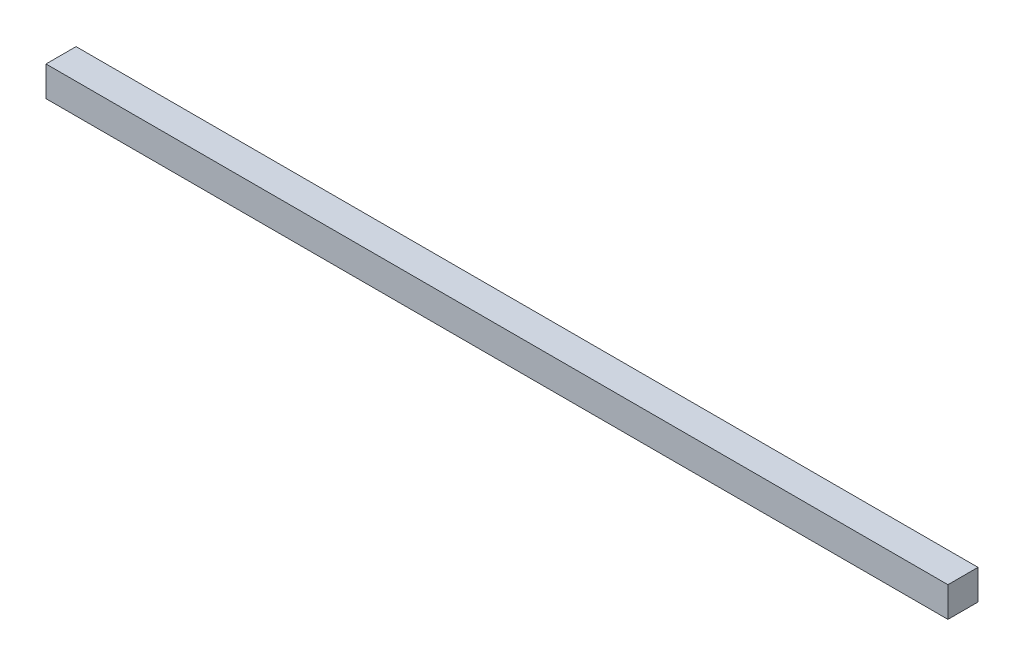
ISO-10303-21;
HEADER;
FILE_DESCRIPTION(('STEP AP214'),'2;1');
FILE_NAME('part.step','',(''),(''),'','','');
FILE_SCHEMA(('AUTOMOTIVE_DESIGN { 1 0 10303 214 1 1 1 1 }'));
ENDSEC;
DATA;
#1=APPLICATION_CONTEXT('core data for automotive mechanical design processes');
#2=APPLICATION_PROTOCOL_DEFINITION('international standard','automotive_design',2000,#1);
#3=PRODUCT_CONTEXT('',#1,'mechanical');
#4=PRODUCT('Part','Part','',(#3));
#5=PRODUCT_RELATED_PRODUCT_CATEGORY('part','',(#4));
#6=PRODUCT_DEFINITION_FORMATION('','',#4);
#7=PRODUCT_DEFINITION_CONTEXT('part definition',#1,'design');
#8=PRODUCT_DEFINITION('design','',#6,#7);
#9=PRODUCT_DEFINITION_SHAPE('','',#8);
#10=(LENGTH_UNIT() NAMED_UNIT(*) SI_UNIT(.MILLI.,.METRE.));
#11=(NAMED_UNIT(*) PLANE_ANGLE_UNIT() SI_UNIT($,.RADIAN.));
#12=(NAMED_UNIT(*) SI_UNIT($,.STERADIAN.) SOLID_ANGLE_UNIT());
#13=UNCERTAINTY_MEASURE_WITH_UNIT(LENGTH_MEASURE(1.E-05),#10,'distance_accuracy_value','');
#14=(GEOMETRIC_REPRESENTATION_CONTEXT(3) GLOBAL_UNCERTAINTY_ASSIGNED_CONTEXT((#13)) GLOBAL_UNIT_ASSIGNED_CONTEXT((#10,
#11,#12)) REPRESENTATION_CONTEXT('',''));
#15=CARTESIAN_POINT('',(0.,0.,0.));
#16=DIRECTION('',(0.,0.,1.));
#17=DIRECTION('',(1.,0.,0.));
#18=AXIS2_PLACEMENT_3D('',#15,#16,#17);
#19=CARTESIAN_POINT('',(762.,0.,0.));
#20=DIRECTION('',(0.,0.,-1.));
#21=DIRECTION('',(0.,1.,0.));
#22=AXIS2_PLACEMENT_3D('',#19,#20,#21);
#23=PLANE('',#22);
#24=DIRECTION('',(0.,-1.,0.));
#25=VECTOR('',#24,1.);
#26=CARTESIAN_POINT('',(0.,0.,0.));
#27=LINE('',#26,#25);
#28=CARTESIAN_POINT('',(0.,0.,0.));
#29=VERTEX_POINT('',#28);
#30=CARTESIAN_POINT('',(0.,-25.4,0.));
#31=VERTEX_POINT('',#30);
#32=EDGE_CURVE('E95',#29,#31,#27,.T.);
#33=ORIENTED_EDGE('',*,*,#32,.T.);
#34=DIRECTION('',(-1.,0.,0.));
#35=VECTOR('',#34,1.);
#36=CARTESIAN_POINT('',(762.,-25.4,0.));
#37=LINE('',#36,#35);
#38=CARTESIAN_POINT('',(762.,-25.4,0.));
#39=VERTEX_POINT('',#38);
#40=EDGE_CURVE('E11',#39,#31,#37,.T.);
#41=ORIENTED_EDGE('',*,*,#40,.F.);
#42=DIRECTION('',(0.,-1.,0.));
#43=VECTOR('',#42,1.);
#44=CARTESIAN_POINT('',(762.,0.,0.));
#45=LINE('',#44,#43);
#46=CARTESIAN_POINT('',(762.,0.,0.));
#47=VERTEX_POINT('',#46);
#48=EDGE_CURVE('E81',#47,#39,#45,.T.);
#49=ORIENTED_EDGE('',*,*,#48,.F.);
#50=DIRECTION('',(-1.,0.,0.));
#51=VECTOR('',#50,1.);
#52=CARTESIAN_POINT('',(762.,0.,0.));
#53=LINE('',#52,#51);
#54=EDGE_CURVE('E48',#47,#29,#53,.T.);
#55=ORIENTED_EDGE('',*,*,#54,.T.);
#56=EDGE_LOOP('',(#33,#41,#49,#55));
#57=FACE_BOUND('',#56,.T.);
#58=ADVANCED_FACE('F32',(#57),#23,.F.);
#59=CARTESIAN_POINT('',(762.,-25.4,0.));
#60=DIRECTION('',(0.,1.,0.));
#61=DIRECTION('',(0.,0.,1.));
#62=AXIS2_PLACEMENT_3D('',#59,#60,#61);
#63=PLANE('',#62);
#64=DIRECTION('',(0.,0.,-1.));
#65=VECTOR('',#64,1.);
#66=CARTESIAN_POINT('',(0.,-25.4,0.));
#67=LINE('',#66,#65);
#68=CARTESIAN_POINT('',(0.,-25.4,-25.4));
#69=VERTEX_POINT('',#68);
#70=EDGE_CURVE('E86',#31,#69,#67,.T.);
#71=ORIENTED_EDGE('',*,*,#70,.T.);
#72=DIRECTION('',(-1.,0.,0.));
#73=VECTOR('',#72,1.);
#74=CARTESIAN_POINT('',(762.,-25.4,-25.4));
#75=LINE('',#74,#73);
#76=CARTESIAN_POINT('',(762.,-25.4,-25.4));
#77=VERTEX_POINT('',#76);
#78=EDGE_CURVE('E40',#77,#69,#75,.T.);
#79=ORIENTED_EDGE('',*,*,#78,.F.);
#80=DIRECTION('',(0.,0.,-1.));
#81=VECTOR('',#80,1.);
#82=CARTESIAN_POINT('',(762.,-25.4,0.));
#83=LINE('',#82,#81);
#84=EDGE_CURVE('E73',#39,#77,#83,.T.);
#85=ORIENTED_EDGE('',*,*,#84,.F.);
#86=ORIENTED_EDGE('',*,*,#40,.T.);
#87=EDGE_LOOP('',(#71,#79,#85,#86));
#88=FACE_BOUND('',#87,.T.);
#89=ADVANCED_FACE('F85',(#88),#63,.F.);
#90=CARTESIAN_POINT('',(762.,0.,-25.4));
#91=DIRECTION('',(0.,0.,-1.));
#92=DIRECTION('',(0.,1.,0.));
#93=AXIS2_PLACEMENT_3D('',#90,#91,#92);
#94=PLANE('',#93);
#95=DIRECTION('',(0.,-1.,0.));
#96=VECTOR('',#95,1.);
#97=CARTESIAN_POINT('',(0.,0.,-25.4));
#98=LINE('',#97,#96);
#99=CARTESIAN_POINT('',(0.,0.,-25.4));
#100=VERTEX_POINT('',#99);
#101=EDGE_CURVE('E98',#100,#69,#98,.T.);
#102=ORIENTED_EDGE('',*,*,#101,.F.);
#103=DIRECTION('',(-1.,0.,0.));
#104=VECTOR('',#103,1.);
#105=CARTESIAN_POINT('',(762.,0.,-25.4));
#106=LINE('',#105,#104);
#107=CARTESIAN_POINT('',(762.,0.,-25.4));
#108=VERTEX_POINT('',#107);
#109=EDGE_CURVE('E62',#108,#100,#106,.T.);
#110=ORIENTED_EDGE('',*,*,#109,.F.);
#111=DIRECTION('',(0.,-1.,0.));
#112=VECTOR('',#111,1.);
#113=CARTESIAN_POINT('',(762.,0.,-25.4));
#114=LINE('',#113,#112);
#115=EDGE_CURVE('E80',#108,#77,#114,.T.);
#116=ORIENTED_EDGE('',*,*,#115,.T.);
#117=ORIENTED_EDGE('',*,*,#78,.T.);
#118=EDGE_LOOP('',(#102,#110,#116,#117));
#119=FACE_BOUND('',#118,.T.);
#120=ADVANCED_FACE('F89',(#119),#94,.T.);
#121=CARTESIAN_POINT('',(762.,0.,0.));
#122=DIRECTION('',(0.,1.,0.));
#123=DIRECTION('',(0.,0.,1.));
#124=AXIS2_PLACEMENT_3D('',#121,#122,#123);
#125=PLANE('',#124);
#126=DIRECTION('',(0.,0.,-1.));
#127=VECTOR('',#126,1.);
#128=CARTESIAN_POINT('',(0.,0.,0.));
#129=LINE('',#128,#127);
#130=EDGE_CURVE('E100',#29,#100,#129,.T.);
#131=ORIENTED_EDGE('',*,*,#130,.F.);
#132=ORIENTED_EDGE('',*,*,#54,.F.);
#133=DIRECTION('',(0.,0.,-1.));
#134=VECTOR('',#133,1.);
#135=CARTESIAN_POINT('',(762.,0.,0.));
#136=LINE('',#135,#134);
#137=EDGE_CURVE('E90',#47,#108,#136,.T.);
#138=ORIENTED_EDGE('',*,*,#137,.T.);
#139=ORIENTED_EDGE('',*,*,#109,.T.);
#140=EDGE_LOOP('',(#131,#132,#138,#139));
#141=FACE_BOUND('',#140,.T.);
#142=ADVANCED_FACE('F106',(#141),#125,.T.);
#143=CARTESIAN_POINT('',(762.,0.,0.));
#144=DIRECTION('',(1.,0.,0.));
#145=DIRECTION('',(0.,0.,-1.));
#146=AXIS2_PLACEMENT_3D('',#143,#144,#145);
#147=PLANE('',#146);
#148=ORIENTED_EDGE('',*,*,#48,.T.);
#149=ORIENTED_EDGE('',*,*,#84,.T.);
#150=ORIENTED_EDGE('',*,*,#115,.F.);
#151=ORIENTED_EDGE('',*,*,#137,.F.);
#152=EDGE_LOOP('',(#148,#149,#150,#151));
#153=FACE_BOUND('',#152,.T.);
#154=ADVANCED_FACE('F77',(#153),#147,.T.);
#155=CARTESIAN_POINT('',(0.,0.,0.));
#156=DIRECTION('',(1.,0.,0.));
#157=DIRECTION('',(0.,0.,-1.));
#158=AXIS2_PLACEMENT_3D('',#155,#156,#157);
#159=PLANE('',#158);
#160=ORIENTED_EDGE('',*,*,#32,.F.);
#161=ORIENTED_EDGE('',*,*,#130,.T.);
#162=ORIENTED_EDGE('',*,*,#101,.T.);
#163=ORIENTED_EDGE('',*,*,#70,.F.);
#164=EDGE_LOOP('',(#160,#161,#162,#163));
#165=FACE_BOUND('',#164,.T.);
#166=ADVANCED_FACE('F105',(#165),#159,.F.);
#167=CLOSED_SHELL('',(#58,#89,#120,#142,#154,#166));
#168=MANIFOLD_SOLID_BREP('B2',#167);
#169=ADVANCED_BREP_SHAPE_REPRESENTATION('',(#18,#168),#14);
#170=SHAPE_DEFINITION_REPRESENTATION(#9,#169);
ENDSEC;
END-ISO-10303-21;
